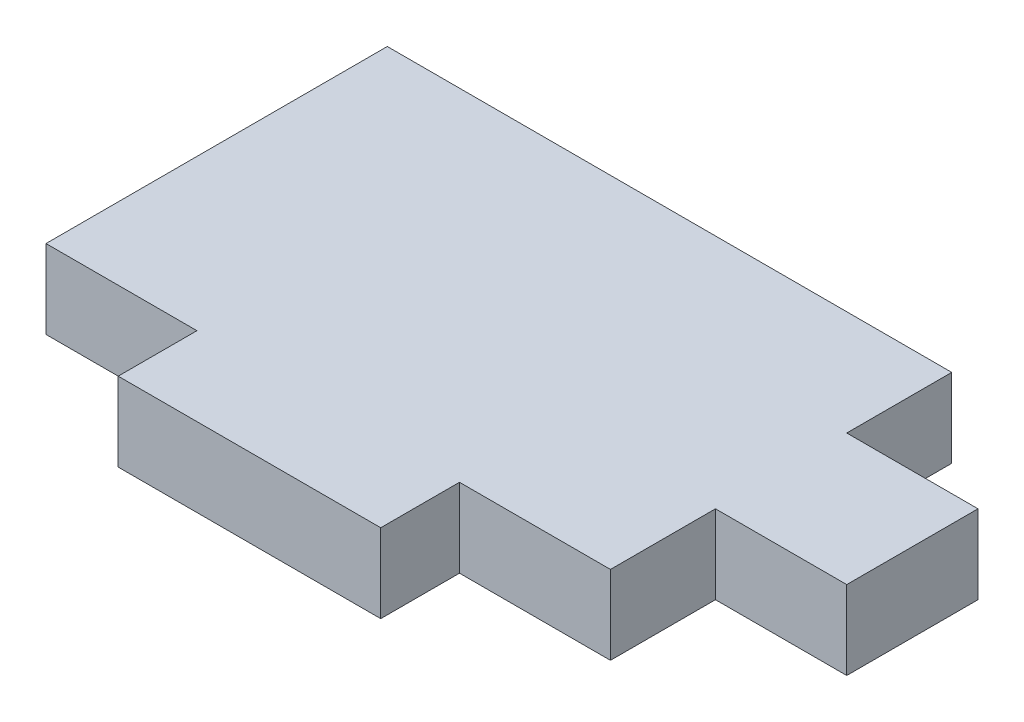
ISO-10303-21;
HEADER;
FILE_DESCRIPTION(('STEP AP214'),'2;1');
FILE_NAME('part.step','',(''),(''),'','','');
FILE_SCHEMA(('AUTOMOTIVE_DESIGN { 1 0 10303 214 1 1 1 1 }'));
ENDSEC;
DATA;
#1=APPLICATION_CONTEXT('core data for automotive mechanical design processes');
#2=APPLICATION_PROTOCOL_DEFINITION('international standard','automotive_design',2000,#1);
#3=PRODUCT_CONTEXT('',#1,'mechanical');
#4=PRODUCT('Part','Part','',(#3));
#5=PRODUCT_RELATED_PRODUCT_CATEGORY('part','',(#4));
#6=PRODUCT_DEFINITION_FORMATION('','',#4);
#7=PRODUCT_DEFINITION_CONTEXT('part definition',#1,'design');
#8=PRODUCT_DEFINITION('design','',#6,#7);
#9=PRODUCT_DEFINITION_SHAPE('','',#8);
#10=(LENGTH_UNIT() NAMED_UNIT(*) SI_UNIT(.MILLI.,.METRE.));
#11=(NAMED_UNIT(*) PLANE_ANGLE_UNIT() SI_UNIT($,.RADIAN.));
#12=(NAMED_UNIT(*) SI_UNIT($,.STERADIAN.) SOLID_ANGLE_UNIT());
#13=UNCERTAINTY_MEASURE_WITH_UNIT(LENGTH_MEASURE(1.E-05),#10,'distance_accuracy_value','');
#14=(GEOMETRIC_REPRESENTATION_CONTEXT(3) GLOBAL_UNCERTAINTY_ASSIGNED_CONTEXT((#13)) GLOBAL_UNIT_ASSIGNED_CONTEXT((#10,
#11,#12)) REPRESENTATION_CONTEXT('',''));
#15=CARTESIAN_POINT('',(0.,0.,0.));
#16=DIRECTION('',(0.,0.,1.));
#17=DIRECTION('',(1.,0.,0.));
#18=AXIS2_PLACEMENT_3D('',#15,#16,#17);
#19=CARTESIAN_POINT('',(-21.5,3.,-13.));
#20=DIRECTION('',(1.,0.,0.));
#21=DIRECTION('',(0.,0.,-1.));
#22=AXIS2_PLACEMENT_3D('',#19,#20,#21);
#23=PLANE('',#22);
#24=DIRECTION('',(0.,0.,1.));
#25=VECTOR('',#24,1.);
#26=CARTESIAN_POINT('',(-21.5,0.,-13.));
#27=LINE('',#26,#25);
#28=CARTESIAN_POINT('',(-21.5,0.,-13.));
#29=VERTEX_POINT('',#28);
#30=CARTESIAN_POINT('',(-21.5,0.,0.));
#31=VERTEX_POINT('',#30);
#32=EDGE_CURVE('E153',#29,#31,#27,.T.);
#33=ORIENTED_EDGE('',*,*,#32,.T.);
#34=DIRECTION('',(0.,-1.,0.));
#35=VECTOR('',#34,1.);
#36=CARTESIAN_POINT('',(-21.5,3.,0.));
#37=LINE('',#36,#35);
#38=CARTESIAN_POINT('',(-21.5,3.,0.));
#39=VERTEX_POINT('',#38);
#40=EDGE_CURVE('E11',#39,#31,#37,.T.);
#41=ORIENTED_EDGE('',*,*,#40,.F.);
#42=DIRECTION('',(0.,0.,1.));
#43=VECTOR('',#42,1.);
#44=CARTESIAN_POINT('',(-21.5,3.,-13.));
#45=LINE('',#44,#43);
#46=CARTESIAN_POINT('',(-21.5,3.,-13.));
#47=VERTEX_POINT('',#46);
#48=EDGE_CURVE('E175',#47,#39,#45,.T.);
#49=ORIENTED_EDGE('',*,*,#48,.F.);
#50=DIRECTION('',(0.,-1.,0.));
#51=VECTOR('',#50,1.);
#52=CARTESIAN_POINT('',(-21.5,3.,-13.));
#53=LINE('',#52,#51);
#54=EDGE_CURVE('E149',#47,#29,#53,.T.);
#55=ORIENTED_EDGE('',*,*,#54,.T.);
#56=EDGE_LOOP('',(#33,#41,#49,#55));
#57=FACE_BOUND('',#56,.T.);
#58=ADVANCED_FACE('F33',(#57),#23,.F.);
#59=CARTESIAN_POINT('',(-21.5,3.,0.));
#60=DIRECTION('',(0.,0.,-1.));
#61=DIRECTION('',(-1.,0.,0.));
#62=AXIS2_PLACEMENT_3D('',#59,#60,#61);
#63=PLANE('',#62);
#64=DIRECTION('',(1.,0.,0.));
#65=VECTOR('',#64,1.);
#66=CARTESIAN_POINT('',(-21.5,0.,0.));
#67=LINE('',#66,#65);
#68=CARTESIAN_POINT('',(-15.75,0.,0.));
#69=VERTEX_POINT('',#68);
#70=EDGE_CURVE('E156',#31,#69,#67,.T.);
#71=ORIENTED_EDGE('',*,*,#70,.T.);
#72=DIRECTION('',(0.,-1.,0.));
#73=VECTOR('',#72,1.);
#74=CARTESIAN_POINT('',(-15.75,3.,0.));
#75=LINE('',#74,#73);
#76=CARTESIAN_POINT('',(-15.75,3.,0.));
#77=VERTEX_POINT('',#76);
#78=EDGE_CURVE('E41',#77,#69,#75,.T.);
#79=ORIENTED_EDGE('',*,*,#78,.F.);
#80=DIRECTION('',(1.,0.,0.));
#81=VECTOR('',#80,1.);
#82=CARTESIAN_POINT('',(-21.5,3.,0.));
#83=LINE('',#82,#81);
#84=EDGE_CURVE('E104',#39,#77,#83,.T.);
#85=ORIENTED_EDGE('',*,*,#84,.F.);
#86=ORIENTED_EDGE('',*,*,#40,.T.);
#87=EDGE_LOOP('',(#71,#79,#85,#86));
#88=FACE_BOUND('',#87,.T.);
#89=ADVANCED_FACE('F253',(#88),#63,.F.);
#90=CARTESIAN_POINT('',(-15.75,3.,0.));
#91=DIRECTION('',(1.,0.,0.));
#92=DIRECTION('',(0.,0.,-1.));
#93=AXIS2_PLACEMENT_3D('',#90,#91,#92);
#94=PLANE('',#93);
#95=DIRECTION('',(0.,0.,1.));
#96=VECTOR('',#95,1.);
#97=CARTESIAN_POINT('',(-15.75,0.,0.));
#98=LINE('',#97,#96);
#99=CARTESIAN_POINT('',(-15.75,0.,3.));
#100=VERTEX_POINT('',#99);
#101=EDGE_CURVE('E158',#69,#100,#98,.T.);
#102=ORIENTED_EDGE('',*,*,#101,.T.);
#103=DIRECTION('',(0.,-1.,0.));
#104=VECTOR('',#103,1.);
#105=CARTESIAN_POINT('',(-15.75,3.,3.));
#106=LINE('',#105,#104);
#107=CARTESIAN_POINT('',(-15.75,3.,3.));
#108=VERTEX_POINT('',#107);
#109=EDGE_CURVE('E194',#108,#100,#106,.T.);
#110=ORIENTED_EDGE('',*,*,#109,.F.);
#111=DIRECTION('',(0.,0.,1.));
#112=VECTOR('',#111,1.);
#113=CARTESIAN_POINT('',(-15.75,3.,0.));
#114=LINE('',#113,#112);
#115=EDGE_CURVE('E202',#77,#108,#114,.T.);
#116=ORIENTED_EDGE('',*,*,#115,.F.);
#117=ORIENTED_EDGE('',*,*,#78,.T.);
#118=EDGE_LOOP('',(#102,#110,#116,#117));
#119=FACE_BOUND('',#118,.T.);
#120=ADVANCED_FACE('F200',(#119),#94,.F.);
#121=CARTESIAN_POINT('',(-15.75,3.,3.));
#122=DIRECTION('',(0.,0.,-1.));
#123=DIRECTION('',(-1.,0.,0.));
#124=AXIS2_PLACEMENT_3D('',#121,#122,#123);
#125=PLANE('',#124);
#126=DIRECTION('',(1.,0.,0.));
#127=VECTOR('',#126,1.);
#128=CARTESIAN_POINT('',(-15.75,0.,3.));
#129=LINE('',#128,#127);
#130=CARTESIAN_POINT('',(-5.75,0.,3.));
#131=VERTEX_POINT('',#130);
#132=EDGE_CURVE('E160',#100,#131,#129,.T.);
#133=ORIENTED_EDGE('',*,*,#132,.T.);
#134=DIRECTION('',(0.,-1.,0.));
#135=VECTOR('',#134,1.);
#136=CARTESIAN_POINT('',(-5.75,3.,3.));
#137=LINE('',#136,#135);
#138=CARTESIAN_POINT('',(-5.75,3.,3.));
#139=VERTEX_POINT('',#138);
#140=EDGE_CURVE('E191',#139,#131,#137,.T.);
#141=ORIENTED_EDGE('',*,*,#140,.F.);
#142=DIRECTION('',(1.,0.,0.));
#143=VECTOR('',#142,1.);
#144=CARTESIAN_POINT('',(-15.75,3.,3.));
#145=LINE('',#144,#143);
#146=EDGE_CURVE('E220',#108,#139,#145,.T.);
#147=ORIENTED_EDGE('',*,*,#146,.F.);
#148=ORIENTED_EDGE('',*,*,#109,.T.);
#149=EDGE_LOOP('',(#133,#141,#147,#148));
#150=FACE_BOUND('',#149,.T.);
#151=ADVANCED_FACE('F211',(#150),#125,.F.);
#152=CARTESIAN_POINT('',(-5.75,3.,3.));
#153=DIRECTION('',(-1.,0.,0.));
#154=DIRECTION('',(0.,0.,1.));
#155=AXIS2_PLACEMENT_3D('',#152,#153,#154);
#156=PLANE('',#155);
#157=DIRECTION('',(0.,0.,-1.));
#158=VECTOR('',#157,1.);
#159=CARTESIAN_POINT('',(-5.75,0.,3.));
#160=LINE('',#159,#158);
#161=CARTESIAN_POINT('',(-5.75,0.,0.));
#162=VERTEX_POINT('',#161);
#163=EDGE_CURVE('E162',#131,#162,#160,.T.);
#164=ORIENTED_EDGE('',*,*,#163,.T.);
#165=DIRECTION('',(0.,-1.,0.));
#166=VECTOR('',#165,1.);
#167=CARTESIAN_POINT('',(-5.75,3.,0.));
#168=LINE('',#167,#166);
#169=CARTESIAN_POINT('',(-5.75,3.,0.));
#170=VERTEX_POINT('',#169);
#171=EDGE_CURVE('E188',#170,#162,#168,.T.);
#172=ORIENTED_EDGE('',*,*,#171,.F.);
#173=DIRECTION('',(0.,0.,-1.));
#174=VECTOR('',#173,1.);
#175=CARTESIAN_POINT('',(-5.75,3.,3.));
#176=LINE('',#175,#174);
#177=EDGE_CURVE('E217',#139,#170,#176,.T.);
#178=ORIENTED_EDGE('',*,*,#177,.F.);
#179=ORIENTED_EDGE('',*,*,#140,.T.);
#180=EDGE_LOOP('',(#164,#172,#178,#179));
#181=FACE_BOUND('',#180,.T.);
#182=ADVANCED_FACE('F215',(#181),#156,.F.);
#183=CARTESIAN_POINT('',(-5.75,3.,0.));
#184=DIRECTION('',(0.,0.,-1.));
#185=DIRECTION('',(-1.,0.,0.));
#186=AXIS2_PLACEMENT_3D('',#183,#184,#185);
#187=PLANE('',#186);
#188=DIRECTION('',(1.,0.,0.));
#189=VECTOR('',#188,1.);
#190=CARTESIAN_POINT('',(-5.75,0.,0.));
#191=LINE('',#190,#189);
#192=CARTESIAN_POINT('',(0.,0.,0.));
#193=VERTEX_POINT('',#192);
#194=EDGE_CURVE('E164',#162,#193,#191,.T.);
#195=ORIENTED_EDGE('',*,*,#194,.T.);
#196=DIRECTION('',(0.,-1.,0.));
#197=VECTOR('',#196,1.);
#198=CARTESIAN_POINT('',(0.,3.,0.));
#199=LINE('',#198,#197);
#200=CARTESIAN_POINT('',(0.,3.,0.));
#201=VERTEX_POINT('',#200);
#202=EDGE_CURVE('E185',#201,#193,#199,.T.);
#203=ORIENTED_EDGE('',*,*,#202,.F.);
#204=DIRECTION('',(1.,0.,0.));
#205=VECTOR('',#204,1.);
#206=CARTESIAN_POINT('',(-5.75,3.,0.));
#207=LINE('',#206,#205);
#208=EDGE_CURVE('E219',#170,#201,#207,.T.);
#209=ORIENTED_EDGE('',*,*,#208,.F.);
#210=ORIENTED_EDGE('',*,*,#171,.T.);
#211=EDGE_LOOP('',(#195,#203,#209,#210));
#212=FACE_BOUND('',#211,.T.);
#213=ADVANCED_FACE('F266',(#212),#187,.F.);
#214=CARTESIAN_POINT('',(0.,3.,-4.00000000000001));
#215=DIRECTION('',(-1.,0.,0.));
#216=DIRECTION('',(0.,0.,1.));
#217=AXIS2_PLACEMENT_3D('',#214,#215,#216);
#218=PLANE('',#217);
#219=DIRECTION('',(0.,0.,-1.));
#220=VECTOR('',#219,1.);
#221=CARTESIAN_POINT('',(0.,0.,-4.00000000000001));
#222=LINE('',#221,#220);
#223=CARTESIAN_POINT('',(0.,0.,-4.00000000000001));
#224=VERTEX_POINT('',#223);
#225=EDGE_CURVE('E166',#193,#224,#222,.T.);
#226=ORIENTED_EDGE('',*,*,#225,.T.);
#227=DIRECTION('',(0.,-1.,0.));
#228=VECTOR('',#227,1.);
#229=CARTESIAN_POINT('',(0.,3.,-4.00000000000001));
#230=LINE('',#229,#228);
#231=CARTESIAN_POINT('',(0.,3.,-4.00000000000001));
#232=VERTEX_POINT('',#231);
#233=EDGE_CURVE('E182',#232,#224,#230,.T.);
#234=ORIENTED_EDGE('',*,*,#233,.F.);
#235=DIRECTION('',(0.,0.,-1.));
#236=VECTOR('',#235,1.);
#237=CARTESIAN_POINT('',(0.,3.,-4.00000000000001));
#238=LINE('',#237,#236);
#239=EDGE_CURVE('E222',#201,#232,#238,.T.);
#240=ORIENTED_EDGE('',*,*,#239,.F.);
#241=ORIENTED_EDGE('',*,*,#202,.T.);
#242=EDGE_LOOP('',(#226,#234,#240,#241));
#243=FACE_BOUND('',#242,.T.);
#244=ADVANCED_FACE('F269',(#243),#218,.F.);
#245=CARTESIAN_POINT('',(5.,3.,-4.00000000000001));
#246=DIRECTION('',(0.,0.,-1.));
#247=DIRECTION('',(-1.,0.,0.));
#248=AXIS2_PLACEMENT_3D('',#245,#246,#247);
#249=PLANE('',#248);
#250=DIRECTION('',(1.,0.,0.));
#251=VECTOR('',#250,1.);
#252=CARTESIAN_POINT('',(5.,0.,-4.00000000000001));
#253=LINE('',#252,#251);
#254=CARTESIAN_POINT('',(5.,0.,-4.00000000000001));
#255=VERTEX_POINT('',#254);
#256=EDGE_CURVE('E168',#224,#255,#253,.T.);
#257=ORIENTED_EDGE('',*,*,#256,.T.);
#258=DIRECTION('',(0.,-1.,0.));
#259=VECTOR('',#258,1.);
#260=CARTESIAN_POINT('',(5.,3.,-4.00000000000001));
#261=LINE('',#260,#259);
#262=CARTESIAN_POINT('',(5.,3.,-4.00000000000001));
#263=VERTEX_POINT('',#262);
#264=EDGE_CURVE('E179',#263,#255,#261,.T.);
#265=ORIENTED_EDGE('',*,*,#264,.F.);
#266=DIRECTION('',(1.,0.,0.));
#267=VECTOR('',#266,1.);
#268=CARTESIAN_POINT('',(5.,3.,-4.00000000000001));
#269=LINE('',#268,#267);
#270=EDGE_CURVE('E228',#232,#263,#269,.T.);
#271=ORIENTED_EDGE('',*,*,#270,.F.);
#272=ORIENTED_EDGE('',*,*,#233,.T.);
#273=EDGE_LOOP('',(#257,#265,#271,#272));
#274=FACE_BOUND('',#273,.T.);
#275=ADVANCED_FACE('F234',(#274),#249,.F.);
#276=CARTESIAN_POINT('',(5.,3.,-9.00000000000001));
#277=DIRECTION('',(-1.,0.,0.));
#278=DIRECTION('',(0.,0.,1.));
#279=AXIS2_PLACEMENT_3D('',#276,#277,#278);
#280=PLANE('',#279);
#281=DIRECTION('',(0.,0.,-1.));
#282=VECTOR('',#281,1.);
#283=CARTESIAN_POINT('',(5.,0.,-9.00000000000001));
#284=LINE('',#283,#282);
#285=CARTESIAN_POINT('',(5.,0.,-9.00000000000001));
#286=VERTEX_POINT('',#285);
#287=EDGE_CURVE('E170',#255,#286,#284,.T.);
#288=ORIENTED_EDGE('',*,*,#287,.T.);
#289=DIRECTION('',(0.,-1.,0.));
#290=VECTOR('',#289,1.);
#291=CARTESIAN_POINT('',(5.,3.,-9.00000000000001));
#292=LINE('',#291,#290);
#293=CARTESIAN_POINT('',(5.,3.,-9.00000000000001));
#294=VERTEX_POINT('',#293);
#295=EDGE_CURVE('E144',#294,#286,#292,.T.);
#296=ORIENTED_EDGE('',*,*,#295,.F.);
#297=DIRECTION('',(0.,0.,-1.));
#298=VECTOR('',#297,1.);
#299=CARTESIAN_POINT('',(5.,3.,-9.00000000000001));
#300=LINE('',#299,#298);
#301=EDGE_CURVE('E135',#263,#294,#300,.T.);
#302=ORIENTED_EDGE('',*,*,#301,.F.);
#303=ORIENTED_EDGE('',*,*,#264,.T.);
#304=EDGE_LOOP('',(#288,#296,#302,#303));
#305=FACE_BOUND('',#304,.T.);
#306=ADVANCED_FACE('F238',(#305),#280,.F.);
#307=CARTESIAN_POINT('',(0.,3.,-9.00000000000001));
#308=DIRECTION('',(0.,0.,1.));
#309=DIRECTION('',(1.,0.,0.));
#310=AXIS2_PLACEMENT_3D('',#307,#308,#309);
#311=PLANE('',#310);
#312=DIRECTION('',(-1.,0.,0.));
#313=VECTOR('',#312,1.);
#314=CARTESIAN_POINT('',(0.,0.,-9.00000000000001));
#315=LINE('',#314,#313);
#316=CARTESIAN_POINT('',(0.,0.,-9.00000000000001));
#317=VERTEX_POINT('',#316);
#318=EDGE_CURVE('E143',#286,#317,#315,.T.);
#319=ORIENTED_EDGE('',*,*,#318,.T.);
#320=DIRECTION('',(0.,-1.,0.));
#321=VECTOR('',#320,1.);
#322=CARTESIAN_POINT('',(0.,3.,-9.00000000000001));
#323=LINE('',#322,#321);
#324=CARTESIAN_POINT('',(0.,3.,-9.00000000000001));
#325=VERTEX_POINT('',#324);
#326=EDGE_CURVE('E140',#325,#317,#323,.T.);
#327=ORIENTED_EDGE('',*,*,#326,.F.);
#328=DIRECTION('',(-1.,0.,0.));
#329=VECTOR('',#328,1.);
#330=CARTESIAN_POINT('',(0.,3.,-9.00000000000001));
#331=LINE('',#330,#329);
#332=EDGE_CURVE('E129',#294,#325,#331,.T.);
#333=ORIENTED_EDGE('',*,*,#332,.F.);
#334=ORIENTED_EDGE('',*,*,#295,.T.);
#335=EDGE_LOOP('',(#319,#327,#333,#334));
#336=FACE_BOUND('',#335,.T.);
#337=ADVANCED_FACE('F141',(#336),#311,.F.);
#338=CARTESIAN_POINT('',(0.,3.,-13.));
#339=DIRECTION('',(-1.,0.,0.));
#340=DIRECTION('',(0.,0.,1.));
#341=AXIS2_PLACEMENT_3D('',#338,#339,#340);
#342=PLANE('',#341);
#343=DIRECTION('',(0.,0.,-1.));
#344=VECTOR('',#343,1.);
#345=CARTESIAN_POINT('',(0.,0.,-13.));
#346=LINE('',#345,#344);
#347=CARTESIAN_POINT('',(0.,0.,-13.));
#348=VERTEX_POINT('',#347);
#349=EDGE_CURVE('E90',#317,#348,#346,.T.);
#350=ORIENTED_EDGE('',*,*,#349,.T.);
#351=DIRECTION('',(0.,-1.,0.));
#352=VECTOR('',#351,1.);
#353=CARTESIAN_POINT('',(0.,3.,-13.));
#354=LINE('',#353,#352);
#355=CARTESIAN_POINT('',(0.,3.,-13.));
#356=VERTEX_POINT('',#355);
#357=EDGE_CURVE('E145',#356,#348,#354,.T.);
#358=ORIENTED_EDGE('',*,*,#357,.F.);
#359=DIRECTION('',(0.,0.,-1.));
#360=VECTOR('',#359,1.);
#361=CARTESIAN_POINT('',(0.,3.,-13.));
#362=LINE('',#361,#360);
#363=EDGE_CURVE('E133',#325,#356,#362,.T.);
#364=ORIENTED_EDGE('',*,*,#363,.F.);
#365=ORIENTED_EDGE('',*,*,#326,.T.);
#366=EDGE_LOOP('',(#350,#358,#364,#365));
#367=FACE_BOUND('',#366,.T.);
#368=ADVANCED_FACE('F147',(#367),#342,.F.);
#369=CARTESIAN_POINT('',(-21.5,3.,-13.));
#370=DIRECTION('',(0.,0.,1.));
#371=DIRECTION('',(1.,0.,0.));
#372=AXIS2_PLACEMENT_3D('',#369,#370,#371);
#373=PLANE('',#372);
#374=DIRECTION('',(-1.,0.,0.));
#375=VECTOR('',#374,1.);
#376=CARTESIAN_POINT('',(-21.5,0.,-13.));
#377=LINE('',#376,#375);
#378=EDGE_CURVE('E96',#348,#29,#377,.T.);
#379=ORIENTED_EDGE('',*,*,#378,.T.);
#380=ORIENTED_EDGE('',*,*,#54,.F.);
#381=DIRECTION('',(-1.,0.,0.));
#382=VECTOR('',#381,1.);
#383=CARTESIAN_POINT('',(-21.5,3.,-13.));
#384=LINE('',#383,#382);
#385=EDGE_CURVE('E49',#356,#47,#384,.T.);
#386=ORIENTED_EDGE('',*,*,#385,.F.);
#387=ORIENTED_EDGE('',*,*,#357,.T.);
#388=EDGE_LOOP('',(#379,#380,#386,#387));
#389=FACE_BOUND('',#388,.T.);
#390=ADVANCED_FACE('F242',(#389),#373,.F.);
#391=CARTESIAN_POINT('',(0.,3.,0.));
#392=DIRECTION('',(0.,1.,0.));
#393=DIRECTION('',(0.,0.,1.));
#394=AXIS2_PLACEMENT_3D('',#391,#392,#393);
#395=PLANE('',#394);
#396=ORIENTED_EDGE('',*,*,#48,.T.);
#397=ORIENTED_EDGE('',*,*,#84,.T.);
#398=ORIENTED_EDGE('',*,*,#115,.T.);
#399=ORIENTED_EDGE('',*,*,#146,.T.);
#400=ORIENTED_EDGE('',*,*,#177,.T.);
#401=ORIENTED_EDGE('',*,*,#208,.T.);
#402=ORIENTED_EDGE('',*,*,#239,.T.);
#403=ORIENTED_EDGE('',*,*,#270,.T.);
#404=ORIENTED_EDGE('',*,*,#301,.T.);
#405=ORIENTED_EDGE('',*,*,#332,.T.);
#406=ORIENTED_EDGE('',*,*,#363,.T.);
#407=ORIENTED_EDGE('',*,*,#385,.T.);
#408=EDGE_LOOP('',(#396,#397,#398,#399,#400,#401,#402,#403,#404,#405,#406,#407));
#409=FACE_BOUND('',#408,.T.);
#410=ADVANCED_FACE('F131',(#409),#395,.T.);
#411=CARTESIAN_POINT('',(0.,0.,0.));
#412=DIRECTION('',(0.,1.,0.));
#413=DIRECTION('',(0.,0.,1.));
#414=AXIS2_PLACEMENT_3D('',#411,#412,#413);
#415=PLANE('',#414);
#416=ORIENTED_EDGE('',*,*,#32,.F.);
#417=ORIENTED_EDGE('',*,*,#378,.F.);
#418=ORIENTED_EDGE('',*,*,#349,.F.);
#419=ORIENTED_EDGE('',*,*,#318,.F.);
#420=ORIENTED_EDGE('',*,*,#287,.F.);
#421=ORIENTED_EDGE('',*,*,#256,.F.);
#422=ORIENTED_EDGE('',*,*,#225,.F.);
#423=ORIENTED_EDGE('',*,*,#194,.F.);
#424=ORIENTED_EDGE('',*,*,#163,.F.);
#425=ORIENTED_EDGE('',*,*,#132,.F.);
#426=ORIENTED_EDGE('',*,*,#101,.F.);
#427=ORIENTED_EDGE('',*,*,#70,.F.);
#428=EDGE_LOOP('',(#416,#417,#418,#419,#420,#421,#422,#423,#424,#425,#426,#427));
#429=FACE_BOUND('',#428,.T.);
#430=ADVANCED_FACE('F206',(#429),#415,.F.);
#431=CLOSED_SHELL('',(#58,#89,#120,#151,#182,#213,#244,#275,#306,#337,#368,#390,#410,#430));
#432=MANIFOLD_SOLID_BREP('B2',#431);
#433=ADVANCED_BREP_SHAPE_REPRESENTATION('',(#18,#432),#14);
#434=SHAPE_DEFINITION_REPRESENTATION(#9,#433);
ENDSEC;
END-ISO-10303-21;
